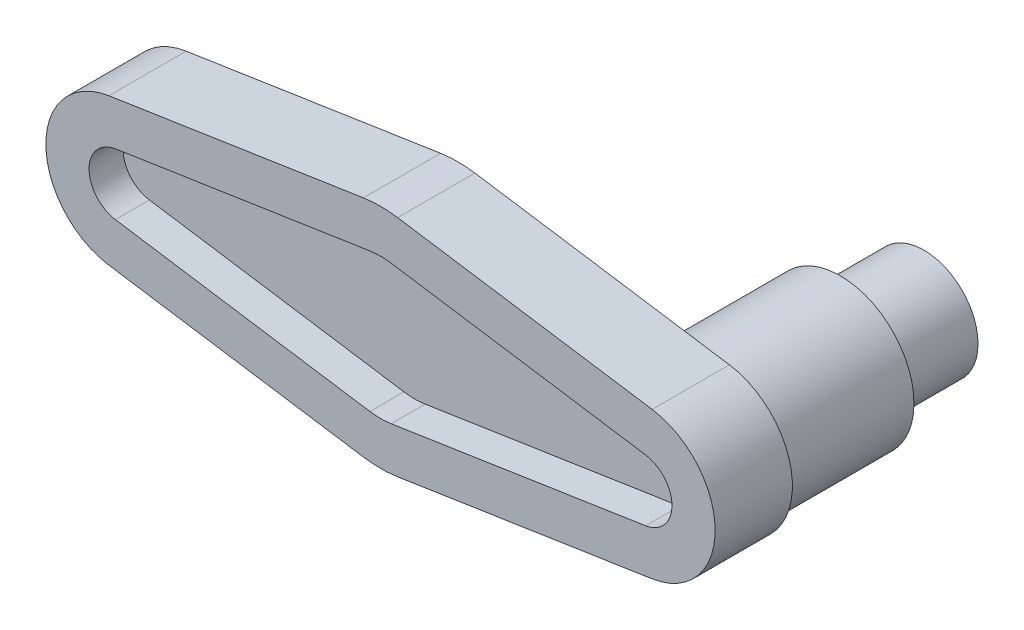
ISO-10303-21;
HEADER;
FILE_DESCRIPTION(('STEP AP214'),'2;1');
FILE_NAME('part.step','',(''),(''),'','','');
FILE_SCHEMA(('AUTOMOTIVE_DESIGN { 1 0 10303 214 1 1 1 1 }'));
ENDSEC;
DATA;
#1=APPLICATION_CONTEXT('core data for automotive mechanical design processes');
#2=APPLICATION_PROTOCOL_DEFINITION('international standard','automotive_design',2000,#1);
#3=PRODUCT_CONTEXT('',#1,'mechanical');
#4=PRODUCT('Part','Part','',(#3));
#5=PRODUCT_RELATED_PRODUCT_CATEGORY('part','',(#4));
#6=PRODUCT_DEFINITION_FORMATION('','',#4);
#7=PRODUCT_DEFINITION_CONTEXT('part definition',#1,'design');
#8=PRODUCT_DEFINITION('design','',#6,#7);
#9=PRODUCT_DEFINITION_SHAPE('','',#8);
#10=(LENGTH_UNIT() NAMED_UNIT(*) SI_UNIT(.MILLI.,.METRE.));
#11=(NAMED_UNIT(*) PLANE_ANGLE_UNIT() SI_UNIT($,.RADIAN.));
#12=(NAMED_UNIT(*) SI_UNIT($,.STERADIAN.) SOLID_ANGLE_UNIT());
#13=UNCERTAINTY_MEASURE_WITH_UNIT(LENGTH_MEASURE(1.E-05),#10,'distance_accuracy_value','');
#14=(GEOMETRIC_REPRESENTATION_CONTEXT(3) GLOBAL_UNCERTAINTY_ASSIGNED_CONTEXT((#13)) GLOBAL_UNIT_ASSIGNED_CONTEXT((#10,
#11,#12)) REPRESENTATION_CONTEXT('',''));
#15=CARTESIAN_POINT('',(0.,0.,0.));
#16=DIRECTION('',(0.,0.,1.));
#17=DIRECTION('',(1.,0.,0.));
#18=AXIS2_PLACEMENT_3D('',#15,#16,#17);
#19=CARTESIAN_POINT('',(-0.509415328671595,-3.3334105627571,-2.));
#20=DIRECTION('',(-0.151067206207441,-0.988523494515269,0.));
#21=DIRECTION('',(0.988523494515269,-0.151067206207441,0.));
#22=AXIS2_PLACEMENT_3D('',#19,#20,#21);
#23=PLANE('',#22);
#24=DIRECTION('',(-0.988523494515269,0.151067206207441,0.));
#25=VECTOR('',#24,1.);
#26=CARTESIAN_POINT('',(-0.509415328671595,-3.3334105627571,0.));
#27=LINE('',#26,#25);
#28=CARTESIAN_POINT('',(4.42533710233228,-4.08754464982064,0.));
#29=VERTEX_POINT('',#28);
#30=CARTESIAN_POINT('',(-10.5365026242203,-1.80106047442719,0.));
#31=VERTEX_POINT('',#30);
#32=EDGE_CURVE('E219',#29,#31,#27,.T.);
#33=ORIENTED_EDGE('',*,*,#32,.F.);
#34=DIRECTION('',(0.,0.,1.));
#35=VECTOR('',#34,1.);
#36=CARTESIAN_POINT('',(4.42533710233228,-4.08754464982064,-2.));
#37=LINE('',#36,#35);
#38=CARTESIAN_POINT('',(4.42533710233228,-4.08754464982064,-2.));
#39=VERTEX_POINT('',#38);
#40=EDGE_CURVE('E119',#39,#29,#37,.T.);
#41=ORIENTED_EDGE('',*,*,#40,.F.);
#42=DIRECTION('',(-0.988523494515269,0.151067206207441,0.));
#43=VECTOR('',#42,1.);
#44=CARTESIAN_POINT('',(-0.509415328671595,-3.3334105627571,-2.));
#45=LINE('',#44,#43);
#46=CARTESIAN_POINT('',(-10.5365026242203,-1.80106047442719,-2.));
#47=VERTEX_POINT('',#46);
#48=EDGE_CURVE('E124',#39,#47,#45,.T.);
#49=ORIENTED_EDGE('',*,*,#48,.T.);
#50=DIRECTION('',(0.,0.,1.));
#51=VECTOR('',#50,1.);
#52=CARTESIAN_POINT('',(-10.5365026242203,-1.80106047442719,-2.));
#53=LINE('',#52,#51);
#54=EDGE_CURVE('E11',#47,#31,#53,.T.);
#55=ORIENTED_EDGE('',*,*,#54,.T.);
#56=EDGE_LOOP('',(#33,#41,#49,#55));
#57=FACE_BOUND('',#56,.T.);
#58=ADVANCED_FACE('F43',(#57),#23,.F.);
#59=CARTESIAN_POINT('',(-10.2609482374131,0.00205743722317206,-2.));
#60=DIRECTION('',(0.,0.,1.));
#61=DIRECTION('',(-1.,0.,0.));
#62=AXIS2_PLACEMENT_3D('',#59,#60,#61);
#63=CYLINDRICAL_SURFACE('',#62,1.82405165042085);
#64=CARTESIAN_POINT('',(-10.2609482374131,0.00205743722317206,0.));
#65=DIRECTION('',(0.,0.,1.));
#66=DIRECTION('',(1.,0.,0.));
#67=AXIS2_PLACEMENT_3D('',#64,#65,#66);
#68=CIRCLE('',#67,1.82405165042085);
#69=CARTESIAN_POINT('',(-10.5360180196135,1.80524934002311,0.));
#70=VERTEX_POINT('',#69);
#71=EDGE_CURVE('E221',#31,#70,#68,.F.);
#72=ORIENTED_EDGE('',*,*,#71,.F.);
#73=ORIENTED_EDGE('',*,*,#54,.F.);
#74=CARTESIAN_POINT('',(-10.2609482374131,0.00205743722317206,-2.));
#75=DIRECTION('',(0.,0.,1.));
#76=DIRECTION('',(1.,0.,0.));
#77=AXIS2_PLACEMENT_3D('',#74,#75,#76);
#78=CIRCLE('',#77,1.82405165042085);
#79=CARTESIAN_POINT('',(-10.5360180196135,1.80524934002311,-2.));
#80=VERTEX_POINT('',#79);
#81=EDGE_CURVE('E251',#47,#80,#78,.F.);
#82=ORIENTED_EDGE('',*,*,#81,.T.);
#83=DIRECTION('',(0.,0.,1.));
#84=VECTOR('',#83,1.);
#85=CARTESIAN_POINT('',(-10.5360180196135,1.80524934002311,-2.));
#86=LINE('',#85,#84);
#87=EDGE_CURVE('E53',#80,#70,#86,.T.);
#88=ORIENTED_EDGE('',*,*,#87,.T.);
#89=EDGE_LOOP('',(#72,#73,#82,#88));
#90=FACE_BOUND('',#89,.T.);
#91=ADVANCED_FACE('F248',(#90),#63,.F.);
#92=CARTESIAN_POINT('',(-0.508721767831144,3.33487366439654,-2.));
#93=DIRECTION('',(-0.150801531380359,0.988564058689845,0.));
#94=DIRECTION('',(-0.988564058689845,-0.150801531380359,0.));
#95=AXIS2_PLACEMENT_3D('',#92,#93,#94);
#96=PLANE('',#95);
#97=DIRECTION('',(0.988564058689845,0.150801531380359,0.));
#98=VECTOR('',#97,1.);
#99=CARTESIAN_POINT('',(-0.508721767831144,3.33487366439654,0.));
#100=LINE('',#99,#98);
#101=CARTESIAN_POINT('',(4.42643566774227,4.08771238268251,0.));
#102=VERTEX_POINT('',#101);
#103=EDGE_CURVE('E224',#70,#102,#100,.T.);
#104=ORIENTED_EDGE('',*,*,#103,.F.);
#105=ORIENTED_EDGE('',*,*,#87,.F.);
#106=DIRECTION('',(0.988564058689845,0.150801531380359,0.));
#107=VECTOR('',#106,1.);
#108=CARTESIAN_POINT('',(-0.508721767831144,3.33487366439654,-2.));
#109=LINE('',#108,#107);
#110=CARTESIAN_POINT('',(4.42643566774227,4.08771238268251,-2.));
#111=VERTEX_POINT('',#110);
#112=EDGE_CURVE('E255',#80,#111,#109,.T.);
#113=ORIENTED_EDGE('',*,*,#112,.T.);
#114=DIRECTION('',(0.,0.,1.));
#115=VECTOR('',#114,1.);
#116=CARTESIAN_POINT('',(4.42643566774227,4.08771238268251,-2.));
#117=LINE('',#116,#115);
#118=EDGE_CURVE('E152',#111,#102,#117,.T.);
#119=ORIENTED_EDGE('',*,*,#118,.T.);
#120=EDGE_LOOP('',(#104,#105,#113,#119));
#121=FACE_BOUND('',#120,.T.);
#122=ADVANCED_FACE('F243',(#121),#96,.F.);
#123=CARTESIAN_POINT('',(5.05000000000001,0.,-2.));
#124=DIRECTION('',(0.,0.,1.));
#125=DIRECTION('',(-1.,0.,0.));
#126=AXIS2_PLACEMENT_3D('',#123,#124,#125);
#127=CYLINDRICAL_SURFACE('',#126,4.135);
#128=CARTESIAN_POINT('',(5.05000000000001,0.,0.));
#129=DIRECTION('',(0.,0.,1.));
#130=DIRECTION('',(1.,0.,0.));
#131=AXIS2_PLACEMENT_3D('',#128,#129,#130);
#132=CIRCLE('',#131,4.135);
#133=CARTESIAN_POINT('',(5.67356433225773,4.08771238268252,0.));
#134=VERTEX_POINT('',#133);
#135=EDGE_CURVE('E227',#134,#102,#132,.T.);
#136=ORIENTED_EDGE('',*,*,#135,.T.);
#137=ORIENTED_EDGE('',*,*,#118,.F.);
#138=CARTESIAN_POINT('',(5.05000000000001,0.,-2.));
#139=DIRECTION('',(0.,0.,1.));
#140=DIRECTION('',(1.,0.,0.));
#141=AXIS2_PLACEMENT_3D('',#138,#139,#140);
#142=CIRCLE('',#141,4.135);
#143=CARTESIAN_POINT('',(5.67356433225773,4.08771238268252,-2.));
#144=VERTEX_POINT('',#143);
#145=EDGE_CURVE('E240',#144,#111,#142,.T.);
#146=ORIENTED_EDGE('',*,*,#145,.F.);
#147=DIRECTION('',(0.,0.,1.));
#148=VECTOR('',#147,1.);
#149=CARTESIAN_POINT('',(5.67356433225773,4.08771238268252,-2.));
#150=LINE('',#149,#148);
#151=EDGE_CURVE('E149',#144,#134,#150,.T.);
#152=ORIENTED_EDGE('',*,*,#151,.T.);
#153=EDGE_LOOP('',(#136,#137,#146,#152));
#154=FACE_BOUND('',#153,.T.);
#155=ADVANCED_FACE('F237',(#154),#127,.F.);
#156=CARTESIAN_POINT('',(0.738406896684348,4.84055110096841,-2.));
#157=DIRECTION('',(-0.150801531380345,-0.988564058689847,0.));
#158=DIRECTION('',(0.988564058689847,-0.150801531380345,0.));
#159=AXIS2_PLACEMENT_3D('',#156,#157,#158);
#160=PLANE('',#159);
#161=DIRECTION('',(-0.988564058689847,0.150801531380345,0.));
#162=VECTOR('',#161,1.);
#163=CARTESIAN_POINT('',(0.738406896684348,4.84055110096841,0.));
#164=LINE('',#163,#162);
#165=CARTESIAN_POINT('',(20.6360180196135,1.80524934002333,0.));
#166=VERTEX_POINT('',#165);
#167=EDGE_CURVE('E139',#166,#134,#164,.T.);
#168=ORIENTED_EDGE('',*,*,#167,.T.);
#169=ORIENTED_EDGE('',*,*,#151,.F.);
#170=DIRECTION('',(-0.988564058689847,0.150801531380345,0.));
#171=VECTOR('',#170,1.);
#172=CARTESIAN_POINT('',(0.738406896684348,4.84055110096841,-2.));
#173=LINE('',#172,#171);
#174=CARTESIAN_POINT('',(20.6360180196135,1.80524934002333,-2.));
#175=VERTEX_POINT('',#174);
#176=EDGE_CURVE('E261',#175,#144,#173,.T.);
#177=ORIENTED_EDGE('',*,*,#176,.F.);
#178=DIRECTION('',(0.,0.,1.));
#179=VECTOR('',#178,1.);
#180=CARTESIAN_POINT('',(20.6360180196135,1.80524934002333,-2.));
#181=LINE('',#180,#179);
#182=EDGE_CURVE('E146',#175,#166,#181,.T.);
#183=ORIENTED_EDGE('',*,*,#182,.T.);
#184=EDGE_LOOP('',(#168,#169,#177,#183));
#185=FACE_BOUND('',#184,.T.);
#186=ADVANCED_FACE('F230',(#185),#160,.T.);
#187=CARTESIAN_POINT('',(20.3609482374132,0.00205743722338716,-2.));
#188=DIRECTION('',(0.,0.,1.));
#189=DIRECTION('',(-1.,0.,0.));
#190=AXIS2_PLACEMENT_3D('',#187,#188,#189);
#191=CYLINDRICAL_SURFACE('',#190,1.82405165042085);
#192=CARTESIAN_POINT('',(20.3609482374132,0.00205743722338716,0.));
#193=DIRECTION('',(0.,0.,1.));
#194=DIRECTION('',(1.,0.,0.));
#195=AXIS2_PLACEMENT_3D('',#192,#193,#194);
#196=CIRCLE('',#195,1.82405165042085);
#197=CARTESIAN_POINT('',(20.6365026242203,-1.80106047442697,0.));
#198=VERTEX_POINT('',#197);
#199=EDGE_CURVE('E137',#198,#166,#196,.T.);
#200=ORIENTED_EDGE('',*,*,#199,.T.);
#201=ORIENTED_EDGE('',*,*,#182,.F.);
#202=CARTESIAN_POINT('',(20.3609482374132,0.00205743722338716,-2.));
#203=DIRECTION('',(0.,0.,1.));
#204=DIRECTION('',(1.,0.,0.));
#205=AXIS2_PLACEMENT_3D('',#202,#203,#204);
#206=CIRCLE('',#205,1.82405165042085);
#207=CARTESIAN_POINT('',(20.6365026242203,-1.80106047442697,-2.));
#208=VERTEX_POINT('',#207);
#209=EDGE_CURVE('E264',#208,#175,#206,.T.);
#210=ORIENTED_EDGE('',*,*,#209,.F.);
#211=DIRECTION('',(0.,0.,1.));
#212=VECTOR('',#211,1.);
#213=CARTESIAN_POINT('',(20.6365026242203,-1.80106047442697,-2.));
#214=LINE('',#213,#212);
#215=EDGE_CURVE('E132',#208,#198,#214,.T.);
#216=ORIENTED_EDGE('',*,*,#215,.T.);
#217=EDGE_LOOP('',(#200,#201,#210,#216));
#218=FACE_BOUND('',#217,.T.);
#219=ADVANCED_FACE('F273',(#218),#191,.F.);
#220=CARTESIAN_POINT('',(0.739910466664021,-4.84167873688423,-2.));
#221=DIRECTION('',(-0.151067206207455,0.988523494515267,0.));
#222=DIRECTION('',(-0.988523494515267,-0.151067206207455,0.));
#223=AXIS2_PLACEMENT_3D('',#220,#221,#222);
#224=PLANE('',#223);
#225=DIRECTION('',(0.988523494515267,0.151067206207455,0.));
#226=VECTOR('',#225,1.);
#227=CARTESIAN_POINT('',(0.739910466664021,-4.84167873688423,0.));
#228=LINE('',#227,#226);
#229=CARTESIAN_POINT('',(5.67466289766783,-4.08754464982063,0.));
#230=VERTEX_POINT('',#229);
#231=EDGE_CURVE('E125',#230,#198,#228,.T.);
#232=ORIENTED_EDGE('',*,*,#231,.T.);
#233=ORIENTED_EDGE('',*,*,#215,.F.);
#234=DIRECTION('',(0.988523494515267,0.151067206207455,0.));
#235=VECTOR('',#234,1.);
#236=CARTESIAN_POINT('',(0.739910466664021,-4.84167873688423,-2.));
#237=LINE('',#236,#235);
#238=CARTESIAN_POINT('',(5.67466289766783,-4.08754464982063,-2.));
#239=VERTEX_POINT('',#238);
#240=EDGE_CURVE('E131',#239,#208,#237,.T.);
#241=ORIENTED_EDGE('',*,*,#240,.F.);
#242=DIRECTION('',(0.,0.,1.));
#243=VECTOR('',#242,1.);
#244=CARTESIAN_POINT('',(5.67466289766783,-4.08754464982063,-2.));
#245=LINE('',#244,#243);
#246=EDGE_CURVE('E116',#239,#230,#245,.T.);
#247=ORIENTED_EDGE('',*,*,#246,.T.);
#248=EDGE_LOOP('',(#232,#233,#241,#247));
#249=FACE_BOUND('',#248,.T.);
#250=ADVANCED_FACE('F128',(#249),#224,.T.);
#251=CARTESIAN_POINT('',(-10.2609482374131,0.00205743722317206,-2.));
#252=DIRECTION('',(0.,0.,1.));
#253=DIRECTION('',(-1.,0.,0.));
#254=AXIS2_PLACEMENT_3D('',#251,#252,#253);
#255=CYLINDRICAL_SURFACE('',#254,4.36405165042085);
#256=CARTESIAN_POINT('',(-10.2609482374131,0.00205743722317206,0.));
#257=DIRECTION('',(0.,0.,1.));
#258=DIRECTION('',(1.,0.,0.));
#259=AXIS2_PLACEMENT_3D('',#256,#257,#258);
#260=CIRCLE('',#259,4.36405165042085);
#261=CARTESIAN_POINT('',(-10.9202133279872,-4.31191015049597,0.));
#262=VERTEX_POINT('',#261);
#263=CARTESIAN_POINT('',(-10.9190539093196,4.31620204909532,0.));
#264=VERTEX_POINT('',#263);
#265=EDGE_CURVE('E184',#262,#264,#260,.F.);
#266=ORIENTED_EDGE('',*,*,#265,.T.);
#267=DIRECTION('',(0.,0.,1.));
#268=VECTOR('',#267,1.);
#269=CARTESIAN_POINT('',(-10.9190539093196,4.31620204909532,-2.));
#270=LINE('',#269,#268);
#271=CARTESIAN_POINT('',(-10.9190539093196,4.31620204909532,-4.54));
#272=VERTEX_POINT('',#271);
#273=EDGE_CURVE('E157',#272,#264,#270,.T.);
#274=ORIENTED_EDGE('',*,*,#273,.F.);
#275=CARTESIAN_POINT('',(-10.2609482374131,0.00205743722317206,-4.54));
#276=DIRECTION('',(0.,0.,1.));
#277=DIRECTION('',(1.,0.,0.));
#278=AXIS2_PLACEMENT_3D('',#275,#276,#277);
#279=CIRCLE('',#278,4.36405165042085);
#280=CARTESIAN_POINT('',(-10.9202133279872,-4.31191015049597,-4.54));
#281=VERTEX_POINT('',#280);
#282=EDGE_CURVE('E187',#272,#281,#279,.T.);
#283=ORIENTED_EDGE('',*,*,#282,.T.);
#284=DIRECTION('',(0.,0.,1.));
#285=VECTOR('',#284,1.);
#286=CARTESIAN_POINT('',(-10.9202133279872,-4.31191015049597,-2.));
#287=LINE('',#286,#285);
#288=EDGE_CURVE('E143',#281,#262,#287,.T.);
#289=ORIENTED_EDGE('',*,*,#288,.T.);
#290=EDGE_LOOP('',(#266,#274,#283,#289));
#291=FACE_BOUND('',#290,.T.);
#292=ADVANCED_FACE('F45',(#291),#255,.T.);
#293=CARTESIAN_POINT('',(-0.893126032438493,-5.84426023882588,-2.));
#294=DIRECTION('',(-0.151067206207441,-0.988523494515269,0.));
#295=DIRECTION('',(0.988523494515269,-0.151067206207441,0.));
#296=AXIS2_PLACEMENT_3D('',#293,#294,#295);
#297=PLANE('',#296);
#298=DIRECTION('',(-0.988523494515269,0.151067206207441,0.));
#299=VECTOR('',#298,1.);
#300=CARTESIAN_POINT('',(-0.893126032438493,-5.84426023882588,0.));
#301=LINE('',#300,#299);
#302=CARTESIAN_POINT('',(4.04162639856539,-6.59839432588942,0.));
#303=VERTEX_POINT('',#302);
#304=EDGE_CURVE('E193',#303,#262,#301,.T.);
#305=ORIENTED_EDGE('',*,*,#304,.T.);
#306=ORIENTED_EDGE('',*,*,#288,.F.);
#307=DIRECTION('',(0.988523494515269,-0.151067206207441,0.));
#308=VECTOR('',#307,1.);
#309=CARTESIAN_POINT('',(-0.893126032438493,-5.84426023882588,-4.54));
#310=LINE('',#309,#308);
#311=CARTESIAN_POINT('',(4.04162639856538,-6.59839432588942,-4.54));
#312=VERTEX_POINT('',#311);
#313=EDGE_CURVE('E309',#281,#312,#310,.T.);
#314=ORIENTED_EDGE('',*,*,#313,.T.);
#315=DIRECTION('',(0.,0.,1.));
#316=VECTOR('',#315,1.);
#317=CARTESIAN_POINT('',(4.04162639856539,-6.59839432588942,-2.));
#318=LINE('',#317,#316);
#319=EDGE_CURVE('E175',#312,#303,#318,.T.);
#320=ORIENTED_EDGE('',*,*,#319,.T.);
#321=EDGE_LOOP('',(#305,#306,#314,#320));
#322=FACE_BOUND('',#321,.T.);
#323=ADVANCED_FACE('F339',(#322),#297,.T.);
#324=CARTESIAN_POINT('',(5.05000000000001,0.,-2.));
#325=DIRECTION('',(0.,0.,1.));
#326=DIRECTION('',(-1.,0.,0.));
#327=AXIS2_PLACEMENT_3D('',#324,#325,#326);
#328=CYLINDRICAL_SURFACE('',#327,6.675);
#329=CARTESIAN_POINT('',(5.05000000000001,0.,0.));
#330=DIRECTION('',(0.,0.,1.));
#331=DIRECTION('',(1.,0.,0.));
#332=AXIS2_PLACEMENT_3D('',#329,#330,#331);
#333=CIRCLE('',#332,6.675);
#334=CARTESIAN_POINT('',(6.05837360143477,-6.59839432588941,0.));
#335=VERTEX_POINT('',#334);
#336=EDGE_CURVE('E198',#303,#335,#333,.T.);
#337=ORIENTED_EDGE('',*,*,#336,.F.);
#338=ORIENTED_EDGE('',*,*,#319,.F.);
#339=CARTESIAN_POINT('',(5.05000000000001,0.,-4.54));
#340=DIRECTION('',(0.,0.,1.));
#341=DIRECTION('',(1.,0.,0.));
#342=AXIS2_PLACEMENT_3D('',#339,#340,#341);
#343=CIRCLE('',#342,6.675);
#344=CARTESIAN_POINT('',(6.05837360143477,-6.59839432588941,-4.54));
#345=VERTEX_POINT('',#344);
#346=EDGE_CURVE('E311',#312,#345,#343,.T.);
#347=ORIENTED_EDGE('',*,*,#346,.T.);
#348=DIRECTION('',(0.,0.,1.));
#349=VECTOR('',#348,1.);
#350=CARTESIAN_POINT('',(6.05837360143477,-6.59839432588941,-2.));
#351=LINE('',#350,#349);
#352=EDGE_CURVE('E172',#345,#335,#351,.T.);
#353=ORIENTED_EDGE('',*,*,#352,.T.);
#354=EDGE_LOOP('',(#337,#338,#347,#353));
#355=FACE_BOUND('',#354,.T.);
#356=ADVANCED_FACE('F338',(#355),#328,.T.);
#357=CARTESIAN_POINT('',(1.12362117043096,-7.35252841295301,-2.));
#358=DIRECTION('',(-0.151067206207455,0.988523494515267,0.));
#359=DIRECTION('',(-0.988523494515267,-0.151067206207455,0.));
#360=AXIS2_PLACEMENT_3D('',#357,#358,#359);
#361=PLANE('',#360);
#362=DIRECTION('',(0.988523494515267,0.151067206207455,0.));
#363=VECTOR('',#362,1.);
#364=CARTESIAN_POINT('',(1.12362117043096,-7.35252841295301,0.));
#365=LINE('',#364,#363);
#366=CARTESIAN_POINT('',(21.0202133279873,-4.31191015049575,0.));
#367=VERTEX_POINT('',#366);
#368=EDGE_CURVE('E207',#335,#367,#365,.T.);
#369=ORIENTED_EDGE('',*,*,#368,.F.);
#370=ORIENTED_EDGE('',*,*,#352,.F.);
#371=DIRECTION('',(0.988523494515267,0.151067206207455,0.));
#372=VECTOR('',#371,1.);
#373=CARTESIAN_POINT('',(1.12362117043096,-7.35252841295301,-4.54));
#374=LINE('',#373,#372);
#375=CARTESIAN_POINT('',(21.0202133279873,-4.31191015049575,-4.54));
#376=VERTEX_POINT('',#375);
#377=EDGE_CURVE('E317',#345,#376,#374,.T.);
#378=ORIENTED_EDGE('',*,*,#377,.T.);
#379=DIRECTION('',(0.,0.,1.));
#380=VECTOR('',#379,1.);
#381=CARTESIAN_POINT('',(21.0202133279873,-4.31191015049575,-2.));
#382=LINE('',#381,#380);
#383=EDGE_CURVE('E169',#376,#367,#382,.T.);
#384=ORIENTED_EDGE('',*,*,#383,.T.);
#385=EDGE_LOOP('',(#369,#370,#378,#384));
#386=FACE_BOUND('',#385,.T.);
#387=ADVANCED_FACE('F335',(#386),#361,.F.);
#388=CARTESIAN_POINT('',(20.3609482374132,0.00205743722338716,-2.));
#389=DIRECTION('',(0.,0.,1.));
#390=DIRECTION('',(-1.,0.,0.));
#391=AXIS2_PLACEMENT_3D('',#388,#389,#390);
#392=CYLINDRICAL_SURFACE('',#391,4.36405165042085);
#393=CARTESIAN_POINT('',(20.3609482374132,0.00205743722338716,0.));
#394=DIRECTION('',(0.,0.,1.));
#395=DIRECTION('',(1.,0.,0.));
#396=AXIS2_PLACEMENT_3D('',#393,#394,#395);
#397=CIRCLE('',#396,4.36405165042085);
#398=CARTESIAN_POINT('',(21.0190539093196,4.31620204909554,0.));
#399=VERTEX_POINT('',#398);
#400=EDGE_CURVE('E210',#367,#399,#397,.T.);
#401=ORIENTED_EDGE('',*,*,#400,.F.);
#402=ORIENTED_EDGE('',*,*,#383,.F.);
#403=CARTESIAN_POINT('',(20.3609482374132,0.00205743722338716,-4.54));
#404=DIRECTION('',(0.,0.,1.));
#405=DIRECTION('',(1.,0.,0.));
#406=AXIS2_PLACEMENT_3D('',#403,#404,#405);
#407=CIRCLE('',#406,4.36405165042085);
#408=CARTESIAN_POINT('',(21.0190539093196,4.31620204909554,-4.54));
#409=VERTEX_POINT('',#408);
#410=EDGE_CURVE('E320',#376,#409,#407,.T.);
#411=ORIENTED_EDGE('',*,*,#410,.T.);
#412=DIRECTION('',(0.,0.,1.));
#413=VECTOR('',#412,1.);
#414=CARTESIAN_POINT('',(21.0190539093196,4.31620204909554,-2.));
#415=LINE('',#414,#413);
#416=EDGE_CURVE('E166',#409,#399,#415,.T.);
#417=ORIENTED_EDGE('',*,*,#416,.T.);
#418=EDGE_LOOP('',(#401,#402,#411,#417));
#419=FACE_BOUND('',#418,.T.);
#420=ADVANCED_FACE('F332',(#419),#392,.T.);
#421=CARTESIAN_POINT('',(1.12144278639042,7.35150381004062,-2.));
#422=DIRECTION('',(-0.150801531380345,-0.988564058689847,0.));
#423=DIRECTION('',(0.988564058689847,-0.150801531380345,0.));
#424=AXIS2_PLACEMENT_3D('',#421,#422,#423);
#425=PLANE('',#424);
#426=DIRECTION('',(-0.988564058689847,0.150801531380345,0.));
#427=VECTOR('',#426,1.);
#428=CARTESIAN_POINT('',(1.12144278639042,7.35150381004062,0.));
#429=LINE('',#428,#427);
#430=CARTESIAN_POINT('',(6.05660022196381,6.59866509175473,0.));
#431=VERTEX_POINT('',#430);
#432=EDGE_CURVE('E213',#399,#431,#429,.T.);
#433=ORIENTED_EDGE('',*,*,#432,.F.);
#434=ORIENTED_EDGE('',*,*,#416,.F.);
#435=DIRECTION('',(-0.988564058689847,0.150801531380345,0.));
#436=VECTOR('',#435,1.);
#437=CARTESIAN_POINT('',(1.12144278639042,7.35150381004062,-4.54));
#438=LINE('',#437,#436);
#439=CARTESIAN_POINT('',(6.05660022196381,6.59866509175473,-4.54));
#440=VERTEX_POINT('',#439);
#441=EDGE_CURVE('E201',#409,#440,#438,.T.);
#442=ORIENTED_EDGE('',*,*,#441,.T.);
#443=DIRECTION('',(0.,0.,1.));
#444=VECTOR('',#443,1.);
#445=CARTESIAN_POINT('',(6.05660022196381,6.59866509175473,-2.));
#446=LINE('',#445,#444);
#447=EDGE_CURVE('E163',#440,#431,#446,.T.);
#448=ORIENTED_EDGE('',*,*,#447,.T.);
#449=EDGE_LOOP('',(#433,#434,#442,#448));
#450=FACE_BOUND('',#449,.T.);
#451=ADVANCED_FACE('F326',(#450),#425,.F.);
#452=CARTESIAN_POINT('',(5.05000000000001,0.,-2.));
#453=DIRECTION('',(0.,0.,1.));
#454=DIRECTION('',(-1.,0.,0.));
#455=AXIS2_PLACEMENT_3D('',#452,#453,#454);
#456=CYLINDRICAL_SURFACE('',#455,6.675);
#457=CARTESIAN_POINT('',(5.05000000000001,0.,0.));
#458=DIRECTION('',(0.,0.,1.));
#459=DIRECTION('',(1.,0.,0.));
#460=AXIS2_PLACEMENT_3D('',#457,#458,#459);
#461=CIRCLE('',#460,6.675);
#462=CARTESIAN_POINT('',(4.04339977803616,6.59866509175472,0.));
#463=VERTEX_POINT('',#462);
#464=EDGE_CURVE('E216',#431,#463,#461,.T.);
#465=ORIENTED_EDGE('',*,*,#464,.F.);
#466=ORIENTED_EDGE('',*,*,#447,.F.);
#467=CARTESIAN_POINT('',(5.05000000000001,0.,-4.54));
#468=DIRECTION('',(0.,0.,1.));
#469=DIRECTION('',(1.,0.,0.));
#470=AXIS2_PLACEMENT_3D('',#467,#468,#469);
#471=CIRCLE('',#470,6.675);
#472=CARTESIAN_POINT('',(4.04339977803616,6.59866509175472,-4.54));
#473=VERTEX_POINT('',#472);
#474=EDGE_CURVE('E196',#440,#473,#471,.T.);
#475=ORIENTED_EDGE('',*,*,#474,.T.);
#476=DIRECTION('',(0.,0.,1.));
#477=VECTOR('',#476,1.);
#478=CARTESIAN_POINT('',(4.04339977803616,6.59866509175472,-2.));
#479=LINE('',#478,#477);
#480=EDGE_CURVE('E160',#473,#463,#479,.T.);
#481=ORIENTED_EDGE('',*,*,#480,.T.);
#482=EDGE_LOOP('',(#465,#466,#475,#481));
#483=FACE_BOUND('',#482,.T.);
#484=ADVANCED_FACE('F330',(#483),#456,.T.);
#485=CARTESIAN_POINT('',(-0.891757657537256,5.84582637346875,-2.));
#486=DIRECTION('',(-0.150801531380359,0.988564058689845,0.));
#487=DIRECTION('',(-0.988564058689845,-0.150801531380359,0.));
#488=AXIS2_PLACEMENT_3D('',#485,#486,#487);
#489=PLANE('',#488);
#490=DIRECTION('',(0.988564058689845,0.150801531380359,0.));
#491=VECTOR('',#490,1.);
#492=CARTESIAN_POINT('',(-0.891757657537256,5.84582637346875,0.));
#493=LINE('',#492,#491);
#494=EDGE_CURVE('E195',#264,#463,#493,.T.);
#495=ORIENTED_EDGE('',*,*,#494,.T.);
#496=ORIENTED_EDGE('',*,*,#480,.F.);
#497=DIRECTION('',(-0.988564058689845,-0.150801531380359,0.));
#498=VECTOR('',#497,1.);
#499=CARTESIAN_POINT('',(-0.891757657537256,5.84582637346875,-4.54));
#500=LINE('',#499,#498);
#501=EDGE_CURVE('E303',#473,#272,#500,.T.);
#502=ORIENTED_EDGE('',*,*,#501,.T.);
#503=ORIENTED_EDGE('',*,*,#273,.T.);
#504=EDGE_LOOP('',(#495,#496,#502,#503));
#505=FACE_BOUND('',#504,.T.);
#506=ADVANCED_FACE('F304',(#505),#489,.T.);
#507=CARTESIAN_POINT('',(5.05000000000001,0.,-2.));
#508=DIRECTION('',(0.,0.,1.));
#509=DIRECTION('',(-1.,0.,0.));
#510=AXIS2_PLACEMENT_3D('',#507,#508,#509);
#511=CYLINDRICAL_SURFACE('',#510,4.135);
#512=CARTESIAN_POINT('',(5.05000000000001,0.,0.));
#513=DIRECTION('',(0.,0.,1.));
#514=DIRECTION('',(1.,0.,0.));
#515=AXIS2_PLACEMENT_3D('',#512,#513,#514);
#516=CIRCLE('',#515,4.135);
#517=EDGE_CURVE('E113',#29,#230,#516,.T.);
#518=ORIENTED_EDGE('',*,*,#517,.T.);
#519=ORIENTED_EDGE('',*,*,#246,.F.);
#520=CARTESIAN_POINT('',(5.05000000000001,0.,-2.));
#521=DIRECTION('',(0.,0.,1.));
#522=DIRECTION('',(1.,0.,0.));
#523=AXIS2_PLACEMENT_3D('',#520,#521,#522);
#524=CIRCLE('',#523,4.135);
#525=EDGE_CURVE('E61',#39,#239,#524,.T.);
#526=ORIENTED_EDGE('',*,*,#525,.F.);
#527=ORIENTED_EDGE('',*,*,#40,.T.);
#528=EDGE_LOOP('',(#518,#519,#526,#527));
#529=FACE_BOUND('',#528,.T.);
#530=ADVANCED_FACE('F115',(#529),#511,.F.);
#531=CARTESIAN_POINT('',(0.,0.,0.));
#532=DIRECTION('',(0.,0.,-1.));
#533=DIRECTION('',(1.,0.,0.));
#534=AXIS2_PLACEMENT_3D('',#531,#532,#533);
#535=PLANE('',#534);
#536=ORIENTED_EDGE('',*,*,#265,.F.);
#537=ORIENTED_EDGE('',*,*,#304,.F.);
#538=ORIENTED_EDGE('',*,*,#336,.T.);
#539=ORIENTED_EDGE('',*,*,#368,.T.);
#540=ORIENTED_EDGE('',*,*,#400,.T.);
#541=ORIENTED_EDGE('',*,*,#432,.T.);
#542=ORIENTED_EDGE('',*,*,#464,.T.);
#543=ORIENTED_EDGE('',*,*,#494,.F.);
#544=EDGE_LOOP('',(#536,#537,#538,#539,#540,#541,#542,#543));
#545=FACE_BOUND('',#544,.T.);
#546=ORIENTED_EDGE('',*,*,#32,.T.);
#547=ORIENTED_EDGE('',*,*,#71,.T.);
#548=ORIENTED_EDGE('',*,*,#103,.T.);
#549=ORIENTED_EDGE('',*,*,#135,.F.);
#550=ORIENTED_EDGE('',*,*,#167,.F.);
#551=ORIENTED_EDGE('',*,*,#199,.F.);
#552=ORIENTED_EDGE('',*,*,#231,.F.);
#553=ORIENTED_EDGE('',*,*,#517,.F.);
#554=EDGE_LOOP('',(#546,#547,#548,#549,#550,#551,#552,#553));
#555=FACE_BOUND('',#554,.T.);
#556=ADVANCED_FACE('F135',(#545,#555),#535,.F.);
#557=CARTESIAN_POINT('',(0.,0.,-2.));
#558=DIRECTION('',(0.,0.,-1.));
#559=DIRECTION('',(1.,0.,0.));
#560=AXIS2_PLACEMENT_3D('',#557,#558,#559);
#561=PLANE('',#560);
#562=ORIENTED_EDGE('',*,*,#525,.T.);
#563=ORIENTED_EDGE('',*,*,#240,.T.);
#564=ORIENTED_EDGE('',*,*,#209,.T.);
#565=ORIENTED_EDGE('',*,*,#176,.T.);
#566=ORIENTED_EDGE('',*,*,#145,.T.);
#567=ORIENTED_EDGE('',*,*,#112,.F.);
#568=ORIENTED_EDGE('',*,*,#81,.F.);
#569=ORIENTED_EDGE('',*,*,#48,.F.);
#570=EDGE_LOOP('',(#562,#563,#564,#565,#566,#567,#568,#569));
#571=FACE_BOUND('',#570,.T.);
#572=ADVANCED_FACE('F267',(#571),#561,.F.);
#573=CARTESIAN_POINT('',(0.,0.,-4.54));
#574=DIRECTION('',(0.,0.,-1.));
#575=DIRECTION('',(1.,0.,0.));
#576=AXIS2_PLACEMENT_3D('',#573,#574,#575);
#577=PLANE('',#576);
#578=CARTESIAN_POINT('',(19.7613114684991,0.,-4.54));
#579=DIRECTION('',(0.,0.,1.));
#580=DIRECTION('',(1.,0.,0.));
#581=AXIS2_PLACEMENT_3D('',#578,#579,#580);
#582=CIRCLE('',#581,4.32757381858533);
#583=CARTESIAN_POINT('',(24.0888852870845,0.,-4.54));
#584=VERTEX_POINT('',#583);
#585=EDGE_CURVE('E592',#584,#584,#582,.T.);
#586=ORIENTED_EDGE('',*,*,#585,.T.);
#587=EDGE_LOOP('',(#586));
#588=FACE_BOUND('',#587,.T.);
#589=ORIENTED_EDGE('',*,*,#501,.F.);
#590=ORIENTED_EDGE('',*,*,#474,.F.);
#591=ORIENTED_EDGE('',*,*,#441,.F.);
#592=ORIENTED_EDGE('',*,*,#410,.F.);
#593=ORIENTED_EDGE('',*,*,#377,.F.);
#594=ORIENTED_EDGE('',*,*,#346,.F.);
#595=ORIENTED_EDGE('',*,*,#313,.F.);
#596=ORIENTED_EDGE('',*,*,#282,.F.);
#597=EDGE_LOOP('',(#589,#590,#591,#592,#593,#594,#595,#596));
#598=FACE_BOUND('',#597,.T.);
#599=ADVANCED_FACE('F308',(#588,#598),#577,.T.);
#600=CARTESIAN_POINT('',(19.7613114684991,0.,-24.5633383331597));
#601=DIRECTION('',(0.,0.,1.));
#602=DIRECTION('',(-1.,0.,0.));
#603=AXIS2_PLACEMENT_3D('',#600,#601,#602);
#604=CYLINDRICAL_SURFACE('',#603,4.32757381858533);
#605=ORIENTED_EDGE('',*,*,#585,.F.);
#606=EDGE_LOOP('',(#605));
#607=FACE_BOUND('',#606,.T.);
#608=CARTESIAN_POINT('',(19.7613114684991,0.,-12.3231111603315));
#609=DIRECTION('',(0.,0.,1.));
#610=DIRECTION('',(1.,0.,0.));
#611=AXIS2_PLACEMENT_3D('',#608,#609,#610);
#612=CIRCLE('',#611,4.32757381858533);
#613=CARTESIAN_POINT('',(24.0888852870845,0.,-12.3231111603315));
#614=VERTEX_POINT('',#613);
#615=EDGE_CURVE('E588',#614,#614,#612,.T.);
#616=ORIENTED_EDGE('',*,*,#615,.T.);
#617=EDGE_LOOP('',(#616));
#618=FACE_BOUND('',#617,.T.);
#619=ADVANCED_FACE('F420',(#607,#618),#604,.T.);
#620=CARTESIAN_POINT('',(44.9003136471475,29.3089172189393,-12.3231111603315));
#621=DIRECTION('',(0.,0.,-1.));
#622=DIRECTION('',(0.305396918974843,0.952225142432541,0.));
#623=AXIS2_PLACEMENT_3D('',#620,#621,#622);
#624=PLANE('',#623);
#625=CARTESIAN_POINT('',(19.7613114684991,0.,-12.3231111603315));
#626=DIRECTION('',(0.,0.,1.));
#627=DIRECTION('',(1.,0.,0.));
#628=AXIS2_PLACEMENT_3D('',#625,#626,#627);
#629=CIRCLE('',#628,3.175);
#630=CARTESIAN_POINT('',(22.9363114684991,0.,-12.3231111603315));
#631=VERTEX_POINT('',#630);
#632=EDGE_CURVE('E47',#631,#631,#629,.T.);
#633=ORIENTED_EDGE('',*,*,#632,.T.);
#634=EDGE_LOOP('',(#633));
#635=FACE_BOUND('',#634,.T.);
#636=ORIENTED_EDGE('',*,*,#615,.F.);
#637=EDGE_LOOP('',(#636));
#638=FACE_BOUND('',#637,.T.);
#639=ADVANCED_FACE('F429',(#635,#638),#624,.T.);
#640=CARTESIAN_POINT('',(19.7613114684991,0.,-17.24));
#641=DIRECTION('',(0.,0.,-1.));
#642=DIRECTION('',(1.,0.,0.));
#643=AXIS2_PLACEMENT_3D('',#640,#641,#642);
#644=PLANE('',#643);
#645=CARTESIAN_POINT('',(19.7613114684991,0.,-17.24));
#646=DIRECTION('',(0.,0.,1.));
#647=DIRECTION('',(1.,0.,0.));
#648=AXIS2_PLACEMENT_3D('',#645,#646,#647);
#649=CIRCLE('',#648,3.175);
#650=CARTESIAN_POINT('',(22.9363114684991,0.,-17.24));
#651=VERTEX_POINT('',#650);
#652=EDGE_CURVE('E306',#651,#651,#649,.T.);
#653=ORIENTED_EDGE('',*,*,#652,.F.);
#654=EDGE_LOOP('',(#653));
#655=FACE_BOUND('',#654,.T.);
#656=ADVANCED_FACE('F438',(#655),#644,.T.);
#657=CARTESIAN_POINT('',(19.7613114684991,0.,-17.24));
#658=DIRECTION('',(0.,0.,1.));
#659=DIRECTION('',(-1.,0.,0.));
#660=AXIS2_PLACEMENT_3D('',#657,#658,#659);
#661=CYLINDRICAL_SURFACE('',#660,3.175);
#662=ORIENTED_EDGE('',*,*,#632,.F.);
#663=EDGE_LOOP('',(#662));
#664=FACE_BOUND('',#663,.T.);
#665=ORIENTED_EDGE('',*,*,#652,.T.);
#666=EDGE_LOOP('',(#665));
#667=FACE_BOUND('',#666,.T.);
#668=ADVANCED_FACE('F447',(#664,#667),#661,.T.);
#669=CLOSED_SHELL('',(#58,#91,#122,#155,#186,#219,#250,#292,#323,#356,#387,#420,#451,#484,#506,
#530,#556,#572,#599,#619,#639,#656,#668));
#670=MANIFOLD_SOLID_BREP('B2',#669);
#671=ADVANCED_BREP_SHAPE_REPRESENTATION('',(#18,#670),#14);
#672=SHAPE_DEFINITION_REPRESENTATION(#9,#671);
ENDSEC;
END-ISO-10303-21;
